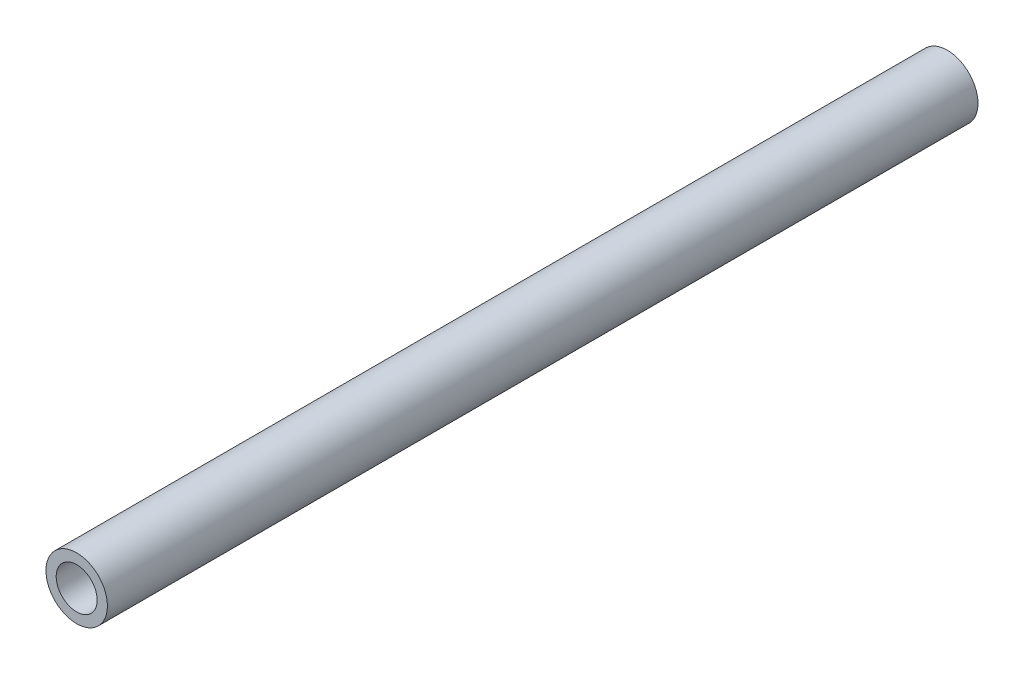
ISO-10303-21;
HEADER;
FILE_DESCRIPTION(('STEP AP214'),'2;1');
FILE_NAME('part.step','',(''),(''),'','','');
FILE_SCHEMA(('AUTOMOTIVE_DESIGN { 1 0 10303 214 1 1 1 1 }'));
ENDSEC;
DATA;
#1=APPLICATION_CONTEXT('core data for automotive mechanical design processes');
#2=APPLICATION_PROTOCOL_DEFINITION('international standard','automotive_design',2000,#1);
#3=PRODUCT_CONTEXT('',#1,'mechanical');
#4=PRODUCT('Part','Part','',(#3));
#5=PRODUCT_RELATED_PRODUCT_CATEGORY('part','',(#4));
#6=PRODUCT_DEFINITION_FORMATION('','',#4);
#7=PRODUCT_DEFINITION_CONTEXT('part definition',#1,'design');
#8=PRODUCT_DEFINITION('design','',#6,#7);
#9=PRODUCT_DEFINITION_SHAPE('','',#8);
#10=(LENGTH_UNIT() NAMED_UNIT(*) SI_UNIT(.MILLI.,.METRE.));
#11=(NAMED_UNIT(*) PLANE_ANGLE_UNIT() SI_UNIT($,.RADIAN.));
#12=(NAMED_UNIT(*) SI_UNIT($,.STERADIAN.) SOLID_ANGLE_UNIT());
#13=UNCERTAINTY_MEASURE_WITH_UNIT(LENGTH_MEASURE(1.E-05),#10,'distance_accuracy_value','');
#14=(GEOMETRIC_REPRESENTATION_CONTEXT(3) GLOBAL_UNCERTAINTY_ASSIGNED_CONTEXT((#13)) GLOBAL_UNIT_ASSIGNED_CONTEXT((#10,
#11,#12)) REPRESENTATION_CONTEXT('',''));
#15=CARTESIAN_POINT('',(0.,0.,0.));
#16=DIRECTION('',(0.,0.,1.));
#17=DIRECTION('',(1.,0.,0.));
#18=AXIS2_PLACEMENT_3D('',#15,#16,#17);
#19=CARTESIAN_POINT('',(0.,0.,85.));
#20=DIRECTION('',(0.,0.,1.));
#21=DIRECTION('',(1.,0.,0.));
#22=AXIS2_PLACEMENT_3D('',#19,#20,#21);
#23=PLANE('',#22);
#24=CARTESIAN_POINT('',(0.,0.,85.));
#25=DIRECTION('',(0.,0.,1.));
#26=DIRECTION('',(1.,0.,0.));
#27=AXIS2_PLACEMENT_3D('',#24,#25,#26);
#28=CIRCLE('',#27,3.);
#29=CARTESIAN_POINT('',(3.,0.,85.));
#30=VERTEX_POINT('',#29);
#31=EDGE_CURVE('E10',#30,#30,#28,.T.);
#32=ORIENTED_EDGE('',*,*,#31,.T.);
#33=EDGE_LOOP('',(#32));
#34=FACE_BOUND('',#33,.T.);
#35=CARTESIAN_POINT('',(0.,0.,85.));
#36=DIRECTION('',(0.,0.,1.));
#37=DIRECTION('',(1.,0.,0.));
#38=AXIS2_PLACEMENT_3D('',#35,#36,#37);
#39=CIRCLE('',#38,2.);
#40=CARTESIAN_POINT('',(2.,0.,85.));
#41=VERTEX_POINT('',#40);
#42=EDGE_CURVE('E54',#41,#41,#39,.T.);
#43=ORIENTED_EDGE('',*,*,#42,.F.);
#44=EDGE_LOOP('',(#43));
#45=FACE_BOUND('',#44,.T.);
#46=ADVANCED_FACE('F41',(#34,#45),#23,.T.);
#47=CARTESIAN_POINT('',(0.,0.,0.));
#48=DIRECTION('',(0.,0.,1.));
#49=DIRECTION('',(1.,0.,0.));
#50=AXIS2_PLACEMENT_3D('',#47,#48,#49);
#51=PLANE('',#50);
#52=CARTESIAN_POINT('',(0.,0.,0.));
#53=DIRECTION('',(0.,0.,1.));
#54=DIRECTION('',(1.,0.,0.));
#55=AXIS2_PLACEMENT_3D('',#52,#53,#54);
#56=CIRCLE('',#55,3.);
#57=CARTESIAN_POINT('',(3.,0.,0.));
#58=VERTEX_POINT('',#57);
#59=EDGE_CURVE('E45',#58,#58,#56,.T.);
#60=ORIENTED_EDGE('',*,*,#59,.F.);
#61=EDGE_LOOP('',(#60));
#62=FACE_BOUND('',#61,.T.);
#63=CARTESIAN_POINT('',(0.,0.,0.));
#64=DIRECTION('',(0.,0.,1.));
#65=DIRECTION('',(1.,0.,0.));
#66=AXIS2_PLACEMENT_3D('',#63,#64,#65);
#67=CIRCLE('',#66,2.);
#68=CARTESIAN_POINT('',(2.,0.,0.));
#69=VERTEX_POINT('',#68);
#70=EDGE_CURVE('E56',#69,#69,#67,.T.);
#71=ORIENTED_EDGE('',*,*,#70,.T.);
#72=EDGE_LOOP('',(#71));
#73=FACE_BOUND('',#72,.T.);
#74=ADVANCED_FACE('F68',(#62,#73),#51,.F.);
#75=CARTESIAN_POINT('',(0.,0.,85.));
#76=DIRECTION('',(0.,0.,-1.));
#77=DIRECTION('',(-1.,0.,0.));
#78=AXIS2_PLACEMENT_3D('',#75,#76,#77);
#79=CYLINDRICAL_SURFACE('',#78,3.);
#80=ORIENTED_EDGE('',*,*,#31,.F.);
#81=EDGE_LOOP('',(#80));
#82=FACE_BOUND('',#81,.T.);
#83=ORIENTED_EDGE('',*,*,#59,.T.);
#84=EDGE_LOOP('',(#83));
#85=FACE_BOUND('',#84,.T.);
#86=ADVANCED_FACE('F43',(#82,#85),#79,.T.);
#87=CARTESIAN_POINT('',(0.,0.,85.));
#88=DIRECTION('',(0.,0.,-1.));
#89=DIRECTION('',(-1.,0.,0.));
#90=AXIS2_PLACEMENT_3D('',#87,#88,#89);
#91=CYLINDRICAL_SURFACE('',#90,2.);
#92=ORIENTED_EDGE('',*,*,#42,.T.);
#93=EDGE_LOOP('',(#92));
#94=FACE_BOUND('',#93,.T.);
#95=ORIENTED_EDGE('',*,*,#70,.F.);
#96=EDGE_LOOP('',(#95));
#97=FACE_BOUND('',#96,.T.);
#98=ADVANCED_FACE('F64',(#94,#97),#91,.F.);
#99=CLOSED_SHELL('',(#46,#74,#86,#98));
#100=MANIFOLD_SOLID_BREP('B2',#99);
#101=ADVANCED_BREP_SHAPE_REPRESENTATION('',(#18,#100),#14);
#102=SHAPE_DEFINITION_REPRESENTATION(#9,#101);
ENDSEC;
END-ISO-10303-21;
